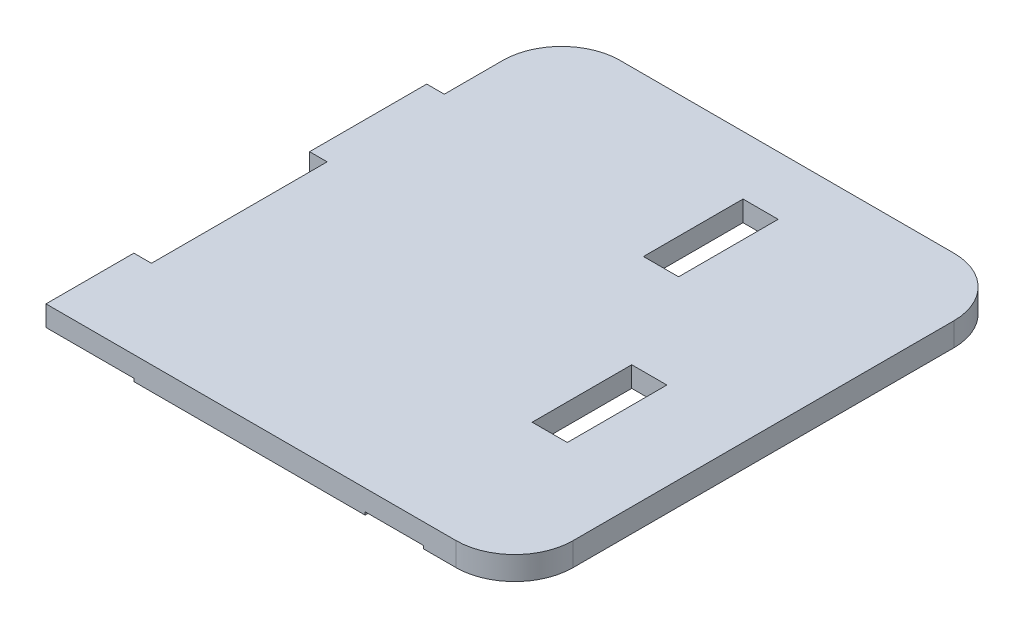
ISO-10303-21;
HEADER;
FILE_DESCRIPTION(('STEP AP214'),'2;1');
FILE_NAME('part.step','',(''),(''),'','','');
FILE_SCHEMA(('AUTOMOTIVE_DESIGN { 1 0 10303 214 1 1 1 1 }'));
ENDSEC;
DATA;
#1=APPLICATION_CONTEXT('core data for automotive mechanical design processes');
#2=APPLICATION_PROTOCOL_DEFINITION('international standard','automotive_design',2000,#1);
#3=PRODUCT_CONTEXT('',#1,'mechanical');
#4=PRODUCT('Part','Part','',(#3));
#5=PRODUCT_RELATED_PRODUCT_CATEGORY('part','',(#4));
#6=PRODUCT_DEFINITION_FORMATION('','',#4);
#7=PRODUCT_DEFINITION_CONTEXT('part definition',#1,'design');
#8=PRODUCT_DEFINITION('design','',#6,#7);
#9=PRODUCT_DEFINITION_SHAPE('','',#8);
#10=(LENGTH_UNIT() NAMED_UNIT(*) SI_UNIT(.MILLI.,.METRE.));
#11=(NAMED_UNIT(*) PLANE_ANGLE_UNIT() SI_UNIT($,.RADIAN.));
#12=(NAMED_UNIT(*) SI_UNIT($,.STERADIAN.) SOLID_ANGLE_UNIT());
#13=UNCERTAINTY_MEASURE_WITH_UNIT(LENGTH_MEASURE(1.E-05),#10,'distance_accuracy_value','');
#14=(GEOMETRIC_REPRESENTATION_CONTEXT(3) GLOBAL_UNCERTAINTY_ASSIGNED_CONTEXT((#13)) GLOBAL_UNIT_ASSIGNED_CONTEXT((#10,
#11,#12)) REPRESENTATION_CONTEXT('',''));
#15=CARTESIAN_POINT('',(0.,0.,0.));
#16=DIRECTION('',(0.,0.,1.));
#17=DIRECTION('',(1.,0.,0.));
#18=AXIS2_PLACEMENT_3D('',#15,#16,#17);
#19=CARTESIAN_POINT('',(0.,0.,0.));
#20=DIRECTION('',(0.,1.,0.));
#21=DIRECTION('',(0.,0.,1.));
#22=AXIS2_PLACEMENT_3D('',#19,#20,#21);
#23=PLANE('',#22);
#24=DIRECTION('',(1.,0.,0.));
#25=VECTOR('',#24,1.);
#26=CARTESIAN_POINT('',(0.,0.,0.));
#27=LINE('',#26,#25);
#28=CARTESIAN_POINT('',(6.448166537674,0.,0.));
#29=VERTEX_POINT('',#28);
#30=CARTESIAN_POINT('',(7.,0.,0.));
#31=VERTEX_POINT('',#30);
#32=EDGE_CURVE('E446',#29,#31,#27,.T.);
#33=ORIENTED_EDGE('',*,*,#32,.F.);
#34=DIRECTION('',(0.,0.,1.));
#35=VECTOR('',#34,1.);
#36=CARTESIAN_POINT('',(6.448166537674,0.,-2.4));
#37=LINE('',#36,#35);
#38=CARTESIAN_POINT('',(6.448166537674,0.,-2.4));
#39=VERTEX_POINT('',#38);
#40=EDGE_CURVE('E282',#39,#29,#37,.T.);
#41=ORIENTED_EDGE('',*,*,#40,.F.);
#42=DIRECTION('',(1.,0.,0.));
#43=VECTOR('',#42,1.);
#44=CARTESIAN_POINT('',(5.9,0.,-2.4));
#45=LINE('',#44,#43);
#46=CARTESIAN_POINT('',(6.5,0.,-2.4));
#47=VERTEX_POINT('',#46);
#48=EDGE_CURVE('E390',#39,#47,#45,.T.);
#49=ORIENTED_EDGE('',*,*,#48,.T.);
#50=DIRECTION('',(0.,0.,-1.));
#51=VECTOR('',#50,1.);
#52=CARTESIAN_POINT('',(6.5,0.,-2.4));
#53=LINE('',#52,#51);
#54=CARTESIAN_POINT('',(6.5,0.,-4.1));
#55=VERTEX_POINT('',#54);
#56=EDGE_CURVE('E403',#47,#55,#53,.T.);
#57=ORIENTED_EDGE('',*,*,#56,.T.);
#58=DIRECTION('',(-1.,0.,0.));
#59=VECTOR('',#58,1.);
#60=CARTESIAN_POINT('',(5.9,0.,-4.1));
#61=LINE('',#60,#59);
#62=CARTESIAN_POINT('',(6.448166537674,0.,-4.1));
#63=VERTEX_POINT('',#62);
#64=EDGE_CURVE('E394',#55,#63,#61,.T.);
#65=ORIENTED_EDGE('',*,*,#64,.T.);
#66=CARTESIAN_POINT('',(6.448166537674,0.,-5.1));
#67=VERTEX_POINT('',#66);
#68=EDGE_CURVE('E276',#67,#63,#37,.T.);
#69=ORIENTED_EDGE('',*,*,#68,.F.);
#70=CARTESIAN_POINT('',(5.9,0.,-5.1));
#71=DIRECTION('',(0.,-1.,0.));
#72=DIRECTION('',(0.,0.,-1.));
#73=AXIS2_PLACEMENT_3D('',#70,#71,#72);
#74=CIRCLE('',#73,0.548166537674001);
#75=CARTESIAN_POINT('',(5.97920351117561,0.,-5.64241437743017));
#76=VERTEX_POINT('',#75);
#77=EDGE_CURVE('E326',#76,#67,#74,.T.);
#78=ORIENTED_EDGE('',*,*,#77,.F.);
#79=DIRECTION('',(0.989506546188972,0.,0.144488044658277));
#80=VECTOR('',#79,1.);
#81=CARTESIAN_POINT('',(5.97920351117561,0.,-5.64241437743017));
#82=LINE('',#81,#80);
#83=CARTESIAN_POINT('',(4.9,0.,-5.8));
#84=VERTEX_POINT('',#83);
#85=EDGE_CURVE('E323',#84,#76,#82,.T.);
#86=ORIENTED_EDGE('',*,*,#85,.F.);
#87=DIRECTION('',(1.,0.,0.));
#88=VECTOR('',#87,1.);
#89=CARTESIAN_POINT('',(4.4,0.,-5.8));
#90=LINE('',#89,#88);
#91=CARTESIAN_POINT('',(5.,0.,-5.8));
#92=VERTEX_POINT('',#91);
#93=EDGE_CURVE('E418',#84,#92,#90,.T.);
#94=ORIENTED_EDGE('',*,*,#93,.T.);
#95=DIRECTION('',(0.,0.,-1.));
#96=VECTOR('',#95,1.);
#97=CARTESIAN_POINT('',(5.,0.,-7.5));
#98=LINE('',#97,#96);
#99=CARTESIAN_POINT('',(5.,0.,-7.5));
#100=VERTEX_POINT('',#99);
#101=EDGE_CURVE('E431',#92,#100,#98,.T.);
#102=ORIENTED_EDGE('',*,*,#101,.T.);
#103=DIRECTION('',(-1.,0.,0.));
#104=VECTOR('',#103,1.);
#105=CARTESIAN_POINT('',(4.4,0.,-7.5));
#106=LINE('',#105,#104);
#107=CARTESIAN_POINT('',(4.9,0.,-7.5));
#108=VERTEX_POINT('',#107);
#109=EDGE_CURVE('E422',#100,#108,#106,.T.);
#110=ORIENTED_EDGE('',*,*,#109,.T.);
#111=DIRECTION('',(0.,0.,1.));
#112=VECTOR('',#111,1.);
#113=CARTESIAN_POINT('',(4.9,0.,-5.8));
#114=LINE('',#113,#112);
#115=CARTESIAN_POINT('',(4.9,0.,-8.5));
#116=VERTEX_POINT('',#115);
#117=EDGE_CURVE('E321',#116,#108,#114,.T.);
#118=ORIENTED_EDGE('',*,*,#117,.F.);
#119=DIRECTION('',(-1.,0.,0.));
#120=VECTOR('',#119,1.);
#121=CARTESIAN_POINT('',(8.,0.,-8.5));
#122=LINE('',#121,#120);
#123=CARTESIAN_POINT('',(7.,0.,-8.5));
#124=VERTEX_POINT('',#123);
#125=EDGE_CURVE('E451',#124,#116,#122,.T.);
#126=ORIENTED_EDGE('',*,*,#125,.F.);
#127=CARTESIAN_POINT('',(7.,0.,-7.5));
#128=DIRECTION('',(0.,1.,0.));
#129=DIRECTION('',(0.,0.,1.));
#130=AXIS2_PLACEMENT_3D('',#127,#128,#129);
#131=CIRCLE('',#130,1.);
#132=CARTESIAN_POINT('',(8.,0.,-7.5));
#133=VERTEX_POINT('',#132);
#134=EDGE_CURVE('E506',#124,#133,#131,.F.);
#135=ORIENTED_EDGE('',*,*,#134,.T.);
#136=DIRECTION('',(0.,0.,-1.));
#137=VECTOR('',#136,1.);
#138=CARTESIAN_POINT('',(8.,0.,0.));
#139=LINE('',#138,#137);
#140=CARTESIAN_POINT('',(8.,0.,-1.));
#141=VERTEX_POINT('',#140);
#142=EDGE_CURVE('E475',#141,#133,#139,.T.);
#143=ORIENTED_EDGE('',*,*,#142,.F.);
#144=CARTESIAN_POINT('',(7.,0.,-1.));
#145=DIRECTION('',(0.,1.,0.));
#146=DIRECTION('',(0.,0.,1.));
#147=AXIS2_PLACEMENT_3D('',#144,#145,#146);
#148=CIRCLE('',#147,1.);
#149=EDGE_CURVE('E508',#141,#31,#148,.F.);
#150=ORIENTED_EDGE('',*,*,#149,.T.);
#151=EDGE_LOOP('',(#33,#41,#49,#57,#65,#69,#78,#86,#94,#102,#110,#118,#126,#135,#143,#150));
#152=FACE_BOUND('',#151,.T.);
#153=ADVANCED_FACE('F35',(#152),#23,.F.);
#154=CARTESIAN_POINT('',(0.,0.4,-1.5));
#155=DIRECTION('',(1.,0.,0.));
#156=DIRECTION('',(0.,0.,-1.));
#157=AXIS2_PLACEMENT_3D('',#154,#155,#156);
#158=PLANE('',#157);
#159=DIRECTION('',(0.,0.,-1.));
#160=VECTOR('',#159,1.);
#161=CARTESIAN_POINT('',(0.,0.05,-8.5));
#162=LINE('',#161,#160);
#163=CARTESIAN_POINT('',(0.,0.05,0.));
#164=VERTEX_POINT('',#163);
#165=CARTESIAN_POINT('',(0.,0.05,-1.5));
#166=VERTEX_POINT('',#165);
#167=EDGE_CURVE('E355',#164,#166,#162,.T.);
#168=ORIENTED_EDGE('',*,*,#167,.F.);
#169=DIRECTION('',(0.,-1.,0.));
#170=VECTOR('',#169,1.);
#171=CARTESIAN_POINT('',(0.,0.4,0.));
#172=LINE('',#171,#170);
#173=CARTESIAN_POINT('',(0.,0.4,0.));
#174=VERTEX_POINT('',#173);
#175=EDGE_CURVE('E498',#174,#164,#172,.T.);
#176=ORIENTED_EDGE('',*,*,#175,.F.);
#177=DIRECTION('',(0.,0.,1.));
#178=VECTOR('',#177,1.);
#179=CARTESIAN_POINT('',(0.,0.4,-1.5));
#180=LINE('',#179,#178);
#181=CARTESIAN_POINT('',(0.,0.4,-1.5));
#182=VERTEX_POINT('',#181);
#183=EDGE_CURVE('E447',#182,#174,#180,.T.);
#184=ORIENTED_EDGE('',*,*,#183,.F.);
#185=DIRECTION('',(0.,-1.,0.));
#186=VECTOR('',#185,1.);
#187=CARTESIAN_POINT('',(0.,0.4,-1.5));
#188=LINE('',#187,#186);
#189=EDGE_CURVE('E472',#182,#166,#188,.T.);
#190=ORIENTED_EDGE('',*,*,#189,.T.);
#191=EDGE_LOOP('',(#168,#176,#184,#190));
#192=FACE_BOUND('',#191,.T.);
#193=ADVANCED_FACE('F617',(#192),#158,.F.);
#194=CARTESIAN_POINT('',(0.299999999999999,0.4,-8.5));
#195=DIRECTION('',(1.,0.,0.));
#196=DIRECTION('',(0.,0.,-1.));
#197=AXIS2_PLACEMENT_3D('',#194,#195,#196);
#198=PLANE('',#197);
#199=DIRECTION('',(0.,0.,-1.));
#200=VECTOR('',#199,1.);
#201=CARTESIAN_POINT('',(0.299999999999999,0.05,-8.5));
#202=LINE('',#201,#200);
#203=CARTESIAN_POINT('',(0.299999999999999,0.05,-6.5));
#204=VERTEX_POINT('',#203);
#205=CARTESIAN_POINT('',(0.299999999999999,0.05,-7.5));
#206=VERTEX_POINT('',#205);
#207=EDGE_CURVE('E58',#204,#206,#202,.T.);
#208=ORIENTED_EDGE('',*,*,#207,.F.);
#209=DIRECTION('',(0.,-1.,0.));
#210=VECTOR('',#209,1.);
#211=CARTESIAN_POINT('',(0.299999999999999,0.4,-6.5));
#212=LINE('',#211,#210);
#213=CARTESIAN_POINT('',(0.299999999999999,0.4,-6.5));
#214=VERTEX_POINT('',#213);
#215=EDGE_CURVE('E495',#214,#204,#212,.T.);
#216=ORIENTED_EDGE('',*,*,#215,.F.);
#217=DIRECTION('',(0.,0.,1.));
#218=VECTOR('',#217,1.);
#219=CARTESIAN_POINT('',(0.299999999999999,0.4,-8.5));
#220=LINE('',#219,#218);
#221=CARTESIAN_POINT('',(0.299999999999999,0.4,-7.5));
#222=VERTEX_POINT('',#221);
#223=EDGE_CURVE('E460',#222,#214,#220,.T.);
#224=ORIENTED_EDGE('',*,*,#223,.F.);
#225=DIRECTION('',(0.,-1.,0.));
#226=VECTOR('',#225,1.);
#227=CARTESIAN_POINT('',(0.299999999999999,0.4,-7.5));
#228=LINE('',#227,#226);
#229=EDGE_CURVE('E524',#222,#206,#228,.T.);
#230=ORIENTED_EDGE('',*,*,#229,.T.);
#231=EDGE_LOOP('',(#208,#216,#224,#230));
#232=FACE_BOUND('',#231,.T.);
#233=ADVANCED_FACE('F588',(#232),#198,.F.);
#234=CARTESIAN_POINT('',(0.299999999999999,0.4,-6.5));
#235=DIRECTION('',(0.,0.,1.));
#236=DIRECTION('',(1.,0.,0.));
#237=AXIS2_PLACEMENT_3D('',#234,#235,#236);
#238=PLANE('',#237);
#239=DIRECTION('',(1.,0.,0.));
#240=VECTOR('',#239,1.);
#241=CARTESIAN_POINT('',(0.299999999999999,0.05,-6.5));
#242=LINE('',#241,#240);
#243=CARTESIAN_POINT('',(0.,0.05,-6.5));
#244=VERTEX_POINT('',#243);
#245=EDGE_CURVE('E365',#244,#204,#242,.T.);
#246=ORIENTED_EDGE('',*,*,#245,.F.);
#247=DIRECTION('',(0.,-1.,0.));
#248=VECTOR('',#247,1.);
#249=CARTESIAN_POINT('',(0.,0.4,-6.5));
#250=LINE('',#249,#248);
#251=CARTESIAN_POINT('',(0.,0.4,-6.5));
#252=VERTEX_POINT('',#251);
#253=EDGE_CURVE('E492',#252,#244,#250,.T.);
#254=ORIENTED_EDGE('',*,*,#253,.F.);
#255=DIRECTION('',(-1.,0.,0.));
#256=VECTOR('',#255,1.);
#257=CARTESIAN_POINT('',(0.299999999999999,0.4,-6.5));
#258=LINE('',#257,#256);
#259=EDGE_CURVE('E462',#214,#252,#258,.T.);
#260=ORIENTED_EDGE('',*,*,#259,.F.);
#261=ORIENTED_EDGE('',*,*,#215,.T.);
#262=EDGE_LOOP('',(#246,#254,#260,#261));
#263=FACE_BOUND('',#262,.T.);
#264=ADVANCED_FACE('F596',(#263),#238,.F.);
#265=CARTESIAN_POINT('',(0.,0.4,-6.5));
#266=DIRECTION('',(1.,0.,0.));
#267=DIRECTION('',(0.,0.,-1.));
#268=AXIS2_PLACEMENT_3D('',#265,#266,#267);
#269=PLANE('',#268);
#270=CARTESIAN_POINT('',(0.,0.05,-4.5));
#271=VERTEX_POINT('',#270);
#272=EDGE_CURVE('E354',#271,#244,#162,.T.);
#273=ORIENTED_EDGE('',*,*,#272,.F.);
#274=DIRECTION('',(0.,-1.,0.));
#275=VECTOR('',#274,1.);
#276=CARTESIAN_POINT('',(0.,0.4,-4.5));
#277=LINE('',#276,#275);
#278=CARTESIAN_POINT('',(0.,0.4,-4.5));
#279=VERTEX_POINT('',#278);
#280=EDGE_CURVE('E489',#279,#271,#277,.T.);
#281=ORIENTED_EDGE('',*,*,#280,.F.);
#282=DIRECTION('',(0.,0.,1.));
#283=VECTOR('',#282,1.);
#284=CARTESIAN_POINT('',(0.,0.4,-6.5));
#285=LINE('',#284,#283);
#286=EDGE_CURVE('E464',#252,#279,#285,.T.);
#287=ORIENTED_EDGE('',*,*,#286,.F.);
#288=ORIENTED_EDGE('',*,*,#253,.T.);
#289=EDGE_LOOP('',(#273,#281,#287,#288));
#290=FACE_BOUND('',#289,.T.);
#291=ADVANCED_FACE('F599',(#290),#269,.F.);
#292=CARTESIAN_POINT('',(0.,0.4,-4.5));
#293=DIRECTION('',(0.,0.,-1.));
#294=DIRECTION('',(-1.,0.,0.));
#295=AXIS2_PLACEMENT_3D('',#292,#293,#294);
#296=PLANE('',#295);
#297=DIRECTION('',(-1.,0.,0.));
#298=VECTOR('',#297,1.);
#299=CARTESIAN_POINT('',(0.,0.05,-4.5));
#300=LINE('',#299,#298);
#301=CARTESIAN_POINT('',(0.3,0.05,-4.5));
#302=VERTEX_POINT('',#301);
#303=EDGE_CURVE('E371',#302,#271,#300,.T.);
#304=ORIENTED_EDGE('',*,*,#303,.F.);
#305=DIRECTION('',(0.,-1.,0.));
#306=VECTOR('',#305,1.);
#307=CARTESIAN_POINT('',(0.3,0.4,-4.5));
#308=LINE('',#307,#306);
#309=CARTESIAN_POINT('',(0.3,0.4,-4.5));
#310=VERTEX_POINT('',#309);
#311=EDGE_CURVE('E486',#310,#302,#308,.T.);
#312=ORIENTED_EDGE('',*,*,#311,.F.);
#313=DIRECTION('',(1.,0.,0.));
#314=VECTOR('',#313,1.);
#315=CARTESIAN_POINT('',(0.,0.4,-4.5));
#316=LINE('',#315,#314);
#317=EDGE_CURVE('E466',#279,#310,#316,.T.);
#318=ORIENTED_EDGE('',*,*,#317,.F.);
#319=ORIENTED_EDGE('',*,*,#280,.T.);
#320=EDGE_LOOP('',(#304,#312,#318,#319));
#321=FACE_BOUND('',#320,.T.);
#322=ADVANCED_FACE('F604',(#321),#296,.F.);
#323=CARTESIAN_POINT('',(0.3,0.4,-4.5));
#324=DIRECTION('',(1.,0.,0.));
#325=DIRECTION('',(0.,0.,-1.));
#326=AXIS2_PLACEMENT_3D('',#323,#324,#325);
#327=PLANE('',#326);
#328=DIRECTION('',(0.,0.,-1.));
#329=VECTOR('',#328,1.);
#330=CARTESIAN_POINT('',(0.3,0.05,-4.5));
#331=LINE('',#330,#329);
#332=CARTESIAN_POINT('',(0.3,0.05,-1.5));
#333=VERTEX_POINT('',#332);
#334=EDGE_CURVE('E369',#333,#302,#331,.T.);
#335=ORIENTED_EDGE('',*,*,#334,.F.);
#336=DIRECTION('',(0.,-1.,0.));
#337=VECTOR('',#336,1.);
#338=CARTESIAN_POINT('',(0.3,0.4,-1.5));
#339=LINE('',#338,#337);
#340=CARTESIAN_POINT('',(0.3,0.4,-1.5));
#341=VERTEX_POINT('',#340);
#342=EDGE_CURVE('E483',#341,#333,#339,.T.);
#343=ORIENTED_EDGE('',*,*,#342,.F.);
#344=DIRECTION('',(0.,0.,1.));
#345=VECTOR('',#344,1.);
#346=CARTESIAN_POINT('',(0.3,0.4,-4.5));
#347=LINE('',#346,#345);
#348=EDGE_CURVE('E468',#310,#341,#347,.T.);
#349=ORIENTED_EDGE('',*,*,#348,.F.);
#350=ORIENTED_EDGE('',*,*,#311,.T.);
#351=EDGE_LOOP('',(#335,#343,#349,#350));
#352=FACE_BOUND('',#351,.T.);
#353=ADVANCED_FACE('F611',(#352),#327,.F.);
#354=CARTESIAN_POINT('',(0.3,0.4,-1.5));
#355=DIRECTION('',(0.,0.,1.));
#356=DIRECTION('',(1.,0.,0.));
#357=AXIS2_PLACEMENT_3D('',#354,#355,#356);
#358=PLANE('',#357);
#359=DIRECTION('',(1.,0.,0.));
#360=VECTOR('',#359,1.);
#361=CARTESIAN_POINT('',(0.3,0.05,-1.5));
#362=LINE('',#361,#360);
#363=EDGE_CURVE('E367',#166,#333,#362,.T.);
#364=ORIENTED_EDGE('',*,*,#363,.F.);
#365=ORIENTED_EDGE('',*,*,#189,.F.);
#366=DIRECTION('',(-1.,0.,0.));
#367=VECTOR('',#366,1.);
#368=CARTESIAN_POINT('',(0.3,0.4,-1.5));
#369=LINE('',#368,#367);
#370=EDGE_CURVE('E470',#341,#182,#369,.T.);
#371=ORIENTED_EDGE('',*,*,#370,.F.);
#372=ORIENTED_EDGE('',*,*,#342,.T.);
#373=EDGE_LOOP('',(#364,#365,#371,#372));
#374=FACE_BOUND('',#373,.T.);
#375=ADVANCED_FACE('F614',(#374),#358,.F.);
#376=CARTESIAN_POINT('',(4.4,0.4,-7.5));
#377=DIRECTION('',(1.,0.,0.));
#378=DIRECTION('',(0.,0.,-1.));
#379=AXIS2_PLACEMENT_3D('',#376,#377,#378);
#380=PLANE('',#379);
#381=DIRECTION('',(0.,-1.,0.));
#382=VECTOR('',#381,1.);
#383=CARTESIAN_POINT('',(4.4,0.4,-5.8));
#384=LINE('',#383,#382);
#385=CARTESIAN_POINT('',(4.4,0.4,-5.8));
#386=VERTEX_POINT('',#385);
#387=CARTESIAN_POINT('',(4.4,0.05,-5.8));
#388=VERTEX_POINT('',#387);
#389=EDGE_CURVE('E443',#386,#388,#384,.T.);
#390=ORIENTED_EDGE('',*,*,#389,.T.);
#391=DIRECTION('',(0.,0.,-1.));
#392=VECTOR('',#391,1.);
#393=CARTESIAN_POINT('',(4.4,0.05,-7.5));
#394=LINE('',#393,#392);
#395=CARTESIAN_POINT('',(4.4,0.05,-7.5));
#396=VERTEX_POINT('',#395);
#397=EDGE_CURVE('E380',#388,#396,#394,.T.);
#398=ORIENTED_EDGE('',*,*,#397,.T.);
#399=DIRECTION('',(0.,-1.,0.));
#400=VECTOR('',#399,1.);
#401=CARTESIAN_POINT('',(4.4,0.4,-7.5));
#402=LINE('',#401,#400);
#403=CARTESIAN_POINT('',(4.4,0.4,-7.5));
#404=VERTEX_POINT('',#403);
#405=EDGE_CURVE('E429',#404,#396,#402,.T.);
#406=ORIENTED_EDGE('',*,*,#405,.F.);
#407=DIRECTION('',(0.,0.,1.));
#408=VECTOR('',#407,1.);
#409=CARTESIAN_POINT('',(4.4,0.4,-7.5));
#410=LINE('',#409,#408);
#411=EDGE_CURVE('E419',#404,#386,#410,.T.);
#412=ORIENTED_EDGE('',*,*,#411,.T.);
#413=EDGE_LOOP('',(#390,#398,#406,#412));
#414=FACE_BOUND('',#413,.T.);
#415=ADVANCED_FACE('F666',(#414),#380,.T.);
#416=CARTESIAN_POINT('',(5.9,0.4,-2.4));
#417=DIRECTION('',(1.,0.,0.));
#418=DIRECTION('',(0.,0.,-1.));
#419=AXIS2_PLACEMENT_3D('',#416,#417,#418);
#420=PLANE('',#419);
#421=DIRECTION('',(0.,-1.,0.));
#422=VECTOR('',#421,1.);
#423=CARTESIAN_POINT('',(5.9,0.4,-2.4));
#424=LINE('',#423,#422);
#425=CARTESIAN_POINT('',(5.9,0.4,-2.4));
#426=VERTEX_POINT('',#425);
#427=CARTESIAN_POINT('',(5.9,0.05,-2.4));
#428=VERTEX_POINT('',#427);
#429=EDGE_CURVE('E415',#426,#428,#424,.T.);
#430=ORIENTED_EDGE('',*,*,#429,.T.);
#431=DIRECTION('',(0.,0.,-1.));
#432=VECTOR('',#431,1.);
#433=CARTESIAN_POINT('',(5.9,0.05,-2.4));
#434=LINE('',#433,#432);
#435=CARTESIAN_POINT('',(5.9,0.05,-4.1));
#436=VERTEX_POINT('',#435);
#437=EDGE_CURVE('E373',#428,#436,#434,.T.);
#438=ORIENTED_EDGE('',*,*,#437,.T.);
#439=DIRECTION('',(0.,-1.,0.));
#440=VECTOR('',#439,1.);
#441=CARTESIAN_POINT('',(5.9,0.4,-4.1));
#442=LINE('',#441,#440);
#443=CARTESIAN_POINT('',(5.9,0.4,-4.1));
#444=VERTEX_POINT('',#443);
#445=EDGE_CURVE('E401',#444,#436,#442,.T.);
#446=ORIENTED_EDGE('',*,*,#445,.F.);
#447=DIRECTION('',(0.,0.,1.));
#448=VECTOR('',#447,1.);
#449=CARTESIAN_POINT('',(5.9,0.4,-2.4));
#450=LINE('',#449,#448);
#451=EDGE_CURVE('E391',#444,#426,#450,.T.);
#452=ORIENTED_EDGE('',*,*,#451,.T.);
#453=EDGE_LOOP('',(#430,#438,#446,#452));
#454=FACE_BOUND('',#453,.T.);
#455=ADVANCED_FACE('F541',(#454),#420,.T.);
#456=CARTESIAN_POINT('',(1.3,0.4,-7.5));
#457=DIRECTION('',(0.,-1.,0.));
#458=DIRECTION('',(0.,0.,-1.));
#459=AXIS2_PLACEMENT_3D('',#456,#457,#458);
#460=CYLINDRICAL_SURFACE('',#459,1.);
#461=DIRECTION('',(0.,-1.,0.));
#462=VECTOR('',#461,1.);
#463=CARTESIAN_POINT('',(1.3,0.4,-8.5));
#464=LINE('',#463,#462);
#465=CARTESIAN_POINT('',(1.3,0.05,-8.5));
#466=VERTEX_POINT('',#465);
#467=CARTESIAN_POINT('',(1.3,0.4,-8.5));
#468=VERTEX_POINT('',#467);
#469=EDGE_CURVE('E519',#466,#468,#464,.F.);
#470=ORIENTED_EDGE('',*,*,#469,.F.);
#471=CARTESIAN_POINT('',(1.3,0.05,-7.5));
#472=DIRECTION('',(0.,-1.,0.));
#473=DIRECTION('',(0.,0.,-1.));
#474=AXIS2_PLACEMENT_3D('',#471,#472,#473);
#475=CIRCLE('',#474,1.);
#476=EDGE_CURVE('E527',#466,#206,#475,.F.);
#477=ORIENTED_EDGE('',*,*,#476,.T.);
#478=ORIENTED_EDGE('',*,*,#229,.F.);
#479=CARTESIAN_POINT('',(1.3,0.4,-7.5));
#480=DIRECTION('',(0.,1.,0.));
#481=DIRECTION('',(0.,0.,1.));
#482=AXIS2_PLACEMENT_3D('',#479,#480,#481);
#483=CIRCLE('',#482,1.);
#484=EDGE_CURVE('E513',#468,#222,#483,.T.);
#485=ORIENTED_EDGE('',*,*,#484,.F.);
#486=EDGE_LOOP('',(#470,#477,#478,#485));
#487=FACE_BOUND('',#486,.T.);
#488=ADVANCED_FACE('F37',(#487),#460,.T.);
#489=CARTESIAN_POINT('',(0.,0.4,0.));
#490=DIRECTION('',(0.,1.,0.));
#491=DIRECTION('',(0.,0.,1.));
#492=AXIS2_PLACEMENT_3D('',#489,#490,#491);
#493=PLANE('',#492);
#494=DIRECTION('',(1.,0.,0.));
#495=VECTOR('',#494,1.);
#496=CARTESIAN_POINT('',(0.,0.4,0.));
#497=LINE('',#496,#495);
#498=CARTESIAN_POINT('',(7.,0.4,0.));
#499=VERTEX_POINT('',#498);
#500=EDGE_CURVE('E450',#174,#499,#497,.T.);
#501=ORIENTED_EDGE('',*,*,#500,.T.);
#502=CARTESIAN_POINT('',(7.,0.4,-1.));
#503=DIRECTION('',(0.,1.,0.));
#504=DIRECTION('',(0.,0.,1.));
#505=AXIS2_PLACEMENT_3D('',#502,#503,#504);
#506=CIRCLE('',#505,1.);
#507=CARTESIAN_POINT('',(8.,0.4,-1.));
#508=VERTEX_POINT('',#507);
#509=EDGE_CURVE('E517',#499,#508,#506,.T.);
#510=ORIENTED_EDGE('',*,*,#509,.T.);
#511=DIRECTION('',(0.,0.,-1.));
#512=VECTOR('',#511,1.);
#513=CARTESIAN_POINT('',(8.,0.4,0.));
#514=LINE('',#513,#512);
#515=CARTESIAN_POINT('',(8.,0.4,-7.5));
#516=VERTEX_POINT('',#515);
#517=EDGE_CURVE('E454',#508,#516,#514,.T.);
#518=ORIENTED_EDGE('',*,*,#517,.T.);
#519=CARTESIAN_POINT('',(7.,0.4,-7.5));
#520=DIRECTION('',(0.,1.,0.));
#521=DIRECTION('',(0.,0.,1.));
#522=AXIS2_PLACEMENT_3D('',#519,#520,#521);
#523=CIRCLE('',#522,1.);
#524=CARTESIAN_POINT('',(7.,0.4,-8.5));
#525=VERTEX_POINT('',#524);
#526=EDGE_CURVE('E515',#516,#525,#523,.T.);
#527=ORIENTED_EDGE('',*,*,#526,.T.);
#528=DIRECTION('',(-1.,0.,0.));
#529=VECTOR('',#528,1.);
#530=CARTESIAN_POINT('',(8.,0.4,-8.5));
#531=LINE('',#530,#529);
#532=EDGE_CURVE('E457',#525,#468,#531,.T.);
#533=ORIENTED_EDGE('',*,*,#532,.T.);
#534=ORIENTED_EDGE('',*,*,#484,.T.);
#535=ORIENTED_EDGE('',*,*,#223,.T.);
#536=ORIENTED_EDGE('',*,*,#259,.T.);
#537=ORIENTED_EDGE('',*,*,#286,.T.);
#538=ORIENTED_EDGE('',*,*,#317,.T.);
#539=ORIENTED_EDGE('',*,*,#348,.T.);
#540=ORIENTED_EDGE('',*,*,#370,.T.);
#541=ORIENTED_EDGE('',*,*,#183,.T.);
#542=EDGE_LOOP('',(#501,#510,#518,#527,#533,#534,#535,#536,#537,#538,#539,#540,#541));
#543=FACE_BOUND('',#542,.T.);
#544=DIRECTION('',(1.,0.,0.));
#545=VECTOR('',#544,1.);
#546=CARTESIAN_POINT('',(4.4,0.4,-5.8));
#547=LINE('',#546,#545);
#548=CARTESIAN_POINT('',(5.,0.4,-5.8));
#549=VERTEX_POINT('',#548);
#550=EDGE_CURVE('E421',#386,#549,#547,.T.);
#551=ORIENTED_EDGE('',*,*,#550,.F.);
#552=ORIENTED_EDGE('',*,*,#411,.F.);
#553=DIRECTION('',(-1.,0.,0.));
#554=VECTOR('',#553,1.);
#555=CARTESIAN_POINT('',(4.4,0.4,-7.5));
#556=LINE('',#555,#554);
#557=CARTESIAN_POINT('',(5.,0.4,-7.5));
#558=VERTEX_POINT('',#557);
#559=EDGE_CURVE('E427',#558,#404,#556,.T.);
#560=ORIENTED_EDGE('',*,*,#559,.F.);
#561=DIRECTION('',(0.,0.,-1.));
#562=VECTOR('',#561,1.);
#563=CARTESIAN_POINT('',(5.,0.4,-7.5));
#564=LINE('',#563,#562);
#565=EDGE_CURVE('E424',#549,#558,#564,.T.);
#566=ORIENTED_EDGE('',*,*,#565,.F.);
#567=EDGE_LOOP('',(#551,#552,#560,#566));
#568=FACE_BOUND('',#567,.T.);
#569=DIRECTION('',(1.,0.,0.));
#570=VECTOR('',#569,1.);
#571=CARTESIAN_POINT('',(5.9,0.4,-2.4));
#572=LINE('',#571,#570);
#573=CARTESIAN_POINT('',(6.5,0.4,-2.4));
#574=VERTEX_POINT('',#573);
#575=EDGE_CURVE('E393',#426,#574,#572,.T.);
#576=ORIENTED_EDGE('',*,*,#575,.F.);
#577=ORIENTED_EDGE('',*,*,#451,.F.);
#578=DIRECTION('',(-1.,0.,0.));
#579=VECTOR('',#578,1.);
#580=CARTESIAN_POINT('',(5.9,0.4,-4.1));
#581=LINE('',#580,#579);
#582=CARTESIAN_POINT('',(6.5,0.4,-4.1));
#583=VERTEX_POINT('',#582);
#584=EDGE_CURVE('E399',#583,#444,#581,.T.);
#585=ORIENTED_EDGE('',*,*,#584,.F.);
#586=DIRECTION('',(0.,0.,-1.));
#587=VECTOR('',#586,1.);
#588=CARTESIAN_POINT('',(6.5,0.4,-2.4));
#589=LINE('',#588,#587);
#590=EDGE_CURVE('E396',#574,#583,#589,.T.);
#591=ORIENTED_EDGE('',*,*,#590,.F.);
#592=EDGE_LOOP('',(#576,#577,#585,#591));
#593=FACE_BOUND('',#592,.T.);
#594=ADVANCED_FACE('F550',(#543,#568,#593),#493,.T.);
#595=CARTESIAN_POINT('',(3.9,0.,-8.5));
#596=VERTEX_POINT('',#595);
#597=CARTESIAN_POINT('',(1.5,0.,-8.5));
#598=VERTEX_POINT('',#597);
#599=EDGE_CURVE('E478',#596,#598,#122,.T.);
#600=ORIENTED_EDGE('',*,*,#599,.F.);
#601=DIRECTION('',(0.,0.,-1.));
#602=VECTOR('',#601,1.);
#603=CARTESIAN_POINT('',(3.9,0.,-5.8));
#604=LINE('',#603,#602);
#605=CARTESIAN_POINT('',(3.9,0.,-5.36770778392691));
#606=VERTEX_POINT('',#605);
#607=EDGE_CURVE('E319',#606,#596,#604,.T.);
#608=ORIENTED_EDGE('',*,*,#607,.F.);
#609=CARTESIAN_POINT('',(4.4,0.,-5.36770778392691));
#610=DIRECTION('',(0.,-1.,0.));
#611=DIRECTION('',(0.,0.,-1.));
#612=AXIS2_PLACEMENT_3D('',#609,#610,#611);
#613=CIRCLE('',#612,0.500000000000001);
#614=CARTESIAN_POINT('',(4.32775597767086,0.,-4.87295451083242));
#615=VERTEX_POINT('',#614);
#616=EDGE_CURVE('E316',#615,#606,#613,.T.);
#617=ORIENTED_EDGE('',*,*,#616,.F.);
#618=DIRECTION('',(-0.989506546188972,0.,-0.144488044658277));
#619=VECTOR('',#618,1.);
#620=CARTESIAN_POINT('',(5.448166537674,0.,-4.70935182255023));
#621=LINE('',#620,#619);
#622=CARTESIAN_POINT('',(5.448166537674,0.,-4.70935182255023));
#623=VERTEX_POINT('',#622);
#624=EDGE_CURVE('E312',#623,#615,#621,.T.);
#625=ORIENTED_EDGE('',*,*,#624,.F.);
#626=DIRECTION('',(0.,0.,-1.));
#627=VECTOR('',#626,1.);
#628=CARTESIAN_POINT('',(5.448166537674,0.,-2.4));
#629=LINE('',#628,#627);
#630=CARTESIAN_POINT('',(5.448166537674,0.,0.));
#631=VERTEX_POINT('',#630);
#632=EDGE_CURVE('E309',#631,#623,#629,.T.);
#633=ORIENTED_EDGE('',*,*,#632,.F.);
#634=CARTESIAN_POINT('',(1.5,0.,0.));
#635=VERTEX_POINT('',#634);
#636=EDGE_CURVE('E474',#635,#631,#27,.T.);
#637=ORIENTED_EDGE('',*,*,#636,.F.);
#638=DIRECTION('',(0.,0.,1.));
#639=VECTOR('',#638,1.);
#640=CARTESIAN_POINT('',(1.5,0.,-8.5));
#641=LINE('',#640,#639);
#642=EDGE_CURVE('E352',#598,#635,#641,.T.);
#643=ORIENTED_EDGE('',*,*,#642,.F.);
#644=EDGE_LOOP('',(#600,#608,#617,#625,#633,#637,#643));
#645=FACE_BOUND('',#644,.T.);
#646=ADVANCED_FACE('F632',(#645),#23,.F.);
#647=CARTESIAN_POINT('',(0.,0.4,0.));
#648=DIRECTION('',(0.,0.,-1.));
#649=DIRECTION('',(-1.,0.,0.));
#650=AXIS2_PLACEMENT_3D('',#647,#648,#649);
#651=PLANE('',#650);
#652=DIRECTION('',(-1.,0.,0.));
#653=VECTOR('',#652,1.);
#654=CARTESIAN_POINT('',(6.448166537674,0.05,0.));
#655=LINE('',#654,#653);
#656=CARTESIAN_POINT('',(6.448166537674,0.05,0.));
#657=VERTEX_POINT('',#656);
#658=CARTESIAN_POINT('',(5.448166537674,0.05,0.));
#659=VERTEX_POINT('',#658);
#660=EDGE_CURVE('E270',#657,#659,#655,.T.);
#661=ORIENTED_EDGE('',*,*,#660,.F.);
#662=DIRECTION('',(0.,-1.,0.));
#663=VECTOR('',#662,1.);
#664=CARTESIAN_POINT('',(6.448166537674,0.05,0.));
#665=LINE('',#664,#663);
#666=EDGE_CURVE('E279',#657,#29,#665,.T.);
#667=ORIENTED_EDGE('',*,*,#666,.T.);
#668=ORIENTED_EDGE('',*,*,#32,.T.);
#669=DIRECTION('',(0.,-1.,0.));
#670=VECTOR('',#669,1.);
#671=CARTESIAN_POINT('',(7.,0.4,0.));
#672=LINE('',#671,#670);
#673=EDGE_CURVE('E511',#31,#499,#672,.F.);
#674=ORIENTED_EDGE('',*,*,#673,.T.);
#675=ORIENTED_EDGE('',*,*,#500,.F.);
#676=ORIENTED_EDGE('',*,*,#175,.T.);
#677=DIRECTION('',(-1.,0.,0.));
#678=VECTOR('',#677,1.);
#679=CARTESIAN_POINT('',(1.5,0.05,0.));
#680=LINE('',#679,#678);
#681=CARTESIAN_POINT('',(1.5,0.05,0.));
#682=VERTEX_POINT('',#681);
#683=EDGE_CURVE('E351',#682,#164,#680,.T.);
#684=ORIENTED_EDGE('',*,*,#683,.F.);
#685=DIRECTION('',(0.,-1.,0.));
#686=VECTOR('',#685,1.);
#687=CARTESIAN_POINT('',(1.5,0.05,0.));
#688=LINE('',#687,#686);
#689=EDGE_CURVE('E359',#682,#635,#688,.T.);
#690=ORIENTED_EDGE('',*,*,#689,.T.);
#691=ORIENTED_EDGE('',*,*,#636,.T.);
#692=DIRECTION('',(0.,-1.,0.));
#693=VECTOR('',#692,1.);
#694=CARTESIAN_POINT('',(5.448166537674,0.05,0.));
#695=LINE('',#694,#693);
#696=EDGE_CURVE('E285',#659,#631,#695,.T.);
#697=ORIENTED_EDGE('',*,*,#696,.F.);
#698=EDGE_LOOP('',(#661,#667,#668,#674,#675,#676,#684,#690,#691,#697));
#699=FACE_BOUND('',#698,.T.);
#700=ADVANCED_FACE('F288',(#699),#651,.F.);
#701=CARTESIAN_POINT('',(8.,0.4,0.));
#702=DIRECTION('',(-1.,0.,0.));
#703=DIRECTION('',(0.,0.,1.));
#704=AXIS2_PLACEMENT_3D('',#701,#702,#703);
#705=PLANE('',#704);
#706=ORIENTED_EDGE('',*,*,#517,.F.);
#707=DIRECTION('',(0.,-1.,0.));
#708=VECTOR('',#707,1.);
#709=CARTESIAN_POINT('',(8.,0.4,-1.));
#710=LINE('',#709,#708);
#711=EDGE_CURVE('E503',#508,#141,#710,.T.);
#712=ORIENTED_EDGE('',*,*,#711,.T.);
#713=ORIENTED_EDGE('',*,*,#142,.T.);
#714=DIRECTION('',(0.,-1.,0.));
#715=VECTOR('',#714,1.);
#716=CARTESIAN_POINT('',(8.,0.4,-7.5));
#717=LINE('',#716,#715);
#718=EDGE_CURVE('E501',#133,#516,#717,.F.);
#719=ORIENTED_EDGE('',*,*,#718,.T.);
#720=EDGE_LOOP('',(#706,#712,#713,#719));
#721=FACE_BOUND('',#720,.T.);
#722=ADVANCED_FACE('F569',(#721),#705,.F.);
#723=CARTESIAN_POINT('',(8.,0.4,-8.5));
#724=DIRECTION('',(0.,0.,1.));
#725=DIRECTION('',(1.,0.,0.));
#726=AXIS2_PLACEMENT_3D('',#723,#724,#725);
#727=PLANE('',#726);
#728=ORIENTED_EDGE('',*,*,#125,.T.);
#729=DIRECTION('',(0.,-1.,0.));
#730=VECTOR('',#729,1.);
#731=CARTESIAN_POINT('',(4.9,0.05,-8.5));
#732=LINE('',#731,#730);
#733=CARTESIAN_POINT('',(4.9,0.05,-8.5));
#734=VERTEX_POINT('',#733);
#735=EDGE_CURVE('E336',#734,#116,#732,.T.);
#736=ORIENTED_EDGE('',*,*,#735,.F.);
#737=DIRECTION('',(1.,0.,0.));
#738=VECTOR('',#737,1.);
#739=CARTESIAN_POINT('',(8.,0.05,-8.5));
#740=LINE('',#739,#738);
#741=CARTESIAN_POINT('',(3.9,0.05,-8.5));
#742=VERTEX_POINT('',#741);
#743=EDGE_CURVE('E386',#742,#734,#740,.T.);
#744=ORIENTED_EDGE('',*,*,#743,.F.);
#745=DIRECTION('',(0.,-1.,0.));
#746=VECTOR('',#745,1.);
#747=CARTESIAN_POINT('',(3.9,0.05,-8.5));
#748=LINE('',#747,#746);
#749=EDGE_CURVE('E338',#742,#596,#748,.T.);
#750=ORIENTED_EDGE('',*,*,#749,.T.);
#751=ORIENTED_EDGE('',*,*,#599,.T.);
#752=DIRECTION('',(0.,-1.,0.));
#753=VECTOR('',#752,1.);
#754=CARTESIAN_POINT('',(1.5,0.05,-8.5));
#755=LINE('',#754,#753);
#756=CARTESIAN_POINT('',(1.5,0.05,-8.5));
#757=VERTEX_POINT('',#756);
#758=EDGE_CURVE('E313',#757,#598,#755,.T.);
#759=ORIENTED_EDGE('',*,*,#758,.F.);
#760=DIRECTION('',(1.,0.,0.));
#761=VECTOR('',#760,1.);
#762=CARTESIAN_POINT('',(1.5,0.05,-8.5));
#763=LINE('',#762,#761);
#764=EDGE_CURVE('E357',#466,#757,#763,.T.);
#765=ORIENTED_EDGE('',*,*,#764,.F.);
#766=ORIENTED_EDGE('',*,*,#469,.T.);
#767=ORIENTED_EDGE('',*,*,#532,.F.);
#768=DIRECTION('',(0.,-1.,0.));
#769=VECTOR('',#768,1.);
#770=CARTESIAN_POINT('',(7.,0.4,-8.5));
#771=LINE('',#770,#769);
#772=EDGE_CURVE('E521',#525,#124,#771,.T.);
#773=ORIENTED_EDGE('',*,*,#772,.T.);
#774=EDGE_LOOP('',(#728,#736,#744,#750,#751,#759,#765,#766,#767,#773));
#775=FACE_BOUND('',#774,.T.);
#776=ADVANCED_FACE('F579',(#775),#727,.F.);
#777=CARTESIAN_POINT('',(4.4,0.4,-5.8));
#778=DIRECTION('',(0.,0.,-1.));
#779=DIRECTION('',(-1.,0.,0.));
#780=AXIS2_PLACEMENT_3D('',#777,#778,#779);
#781=PLANE('',#780);
#782=DIRECTION('',(0.,-1.,0.));
#783=VECTOR('',#782,1.);
#784=CARTESIAN_POINT('',(4.9,0.05,-5.8));
#785=LINE('',#784,#783);
#786=CARTESIAN_POINT('',(4.9,0.05,-5.8));
#787=VERTEX_POINT('',#786);
#788=EDGE_CURVE('E334',#787,#84,#785,.T.);
#789=ORIENTED_EDGE('',*,*,#788,.F.);
#790=DIRECTION('',(-1.,0.,0.));
#791=VECTOR('',#790,1.);
#792=CARTESIAN_POINT('',(4.4,0.05,-5.8));
#793=LINE('',#792,#791);
#794=EDGE_CURVE('E383',#787,#388,#793,.T.);
#795=ORIENTED_EDGE('',*,*,#794,.T.);
#796=ORIENTED_EDGE('',*,*,#389,.F.);
#797=ORIENTED_EDGE('',*,*,#550,.T.);
#798=DIRECTION('',(0.,-1.,0.));
#799=VECTOR('',#798,1.);
#800=CARTESIAN_POINT('',(5.,0.4,-5.8));
#801=LINE('',#800,#799);
#802=EDGE_CURVE('E440',#549,#92,#801,.T.);
#803=ORIENTED_EDGE('',*,*,#802,.T.);
#804=ORIENTED_EDGE('',*,*,#93,.F.);
#805=EDGE_LOOP('',(#789,#795,#796,#797,#803,#804));
#806=FACE_BOUND('',#805,.T.);
#807=ADVANCED_FACE('F671',(#806),#781,.T.);
#808=CARTESIAN_POINT('',(5.,0.4,-7.5));
#809=DIRECTION('',(-1.,0.,0.));
#810=DIRECTION('',(0.,0.,1.));
#811=AXIS2_PLACEMENT_3D('',#808,#809,#810);
#812=PLANE('',#811);
#813=ORIENTED_EDGE('',*,*,#101,.F.);
#814=ORIENTED_EDGE('',*,*,#802,.F.);
#815=ORIENTED_EDGE('',*,*,#565,.T.);
#816=DIRECTION('',(0.,-1.,0.));
#817=VECTOR('',#816,1.);
#818=CARTESIAN_POINT('',(5.,0.4,-7.5));
#819=LINE('',#818,#817);
#820=EDGE_CURVE('E438',#558,#100,#819,.T.);
#821=ORIENTED_EDGE('',*,*,#820,.T.);
#822=EDGE_LOOP('',(#813,#814,#815,#821));
#823=FACE_BOUND('',#822,.T.);
#824=ADVANCED_FACE('F660',(#823),#812,.T.);
#825=CARTESIAN_POINT('',(4.4,0.4,-7.5));
#826=DIRECTION('',(0.,0.,1.));
#827=DIRECTION('',(1.,0.,0.));
#828=AXIS2_PLACEMENT_3D('',#825,#826,#827);
#829=PLANE('',#828);
#830=DIRECTION('',(0.,1.,0.));
#831=VECTOR('',#830,1.);
#832=CARTESIAN_POINT('',(4.9,0.4,-7.5));
#833=LINE('',#832,#831);
#834=CARTESIAN_POINT('',(4.9,0.05,-7.5));
#835=VERTEX_POINT('',#834);
#836=EDGE_CURVE('E11',#108,#835,#833,.T.);
#837=ORIENTED_EDGE('',*,*,#836,.F.);
#838=ORIENTED_EDGE('',*,*,#109,.F.);
#839=ORIENTED_EDGE('',*,*,#820,.F.);
#840=ORIENTED_EDGE('',*,*,#559,.T.);
#841=ORIENTED_EDGE('',*,*,#405,.T.);
#842=DIRECTION('',(1.,0.,0.));
#843=VECTOR('',#842,1.);
#844=CARTESIAN_POINT('',(4.4,0.05,-7.5));
#845=LINE('',#844,#843);
#846=EDGE_CURVE('E377',#396,#835,#845,.T.);
#847=ORIENTED_EDGE('',*,*,#846,.T.);
#848=EDGE_LOOP('',(#837,#838,#839,#840,#841,#847));
#849=FACE_BOUND('',#848,.T.);
#850=ADVANCED_FACE('F654',(#849),#829,.T.);
#851=CARTESIAN_POINT('',(5.9,0.4,-2.4));
#852=DIRECTION('',(0.,0.,-1.));
#853=DIRECTION('',(-1.,0.,0.));
#854=AXIS2_PLACEMENT_3D('',#851,#852,#853);
#855=PLANE('',#854);
#856=DIRECTION('',(0.,-1.,0.));
#857=VECTOR('',#856,1.);
#858=CARTESIAN_POINT('',(6.448166537674,0.4,-2.4));
#859=LINE('',#858,#857);
#860=CARTESIAN_POINT('',(6.448166537674,0.05,-2.4));
#861=VERTEX_POINT('',#860);
#862=EDGE_CURVE('E388',#861,#39,#859,.T.);
#863=ORIENTED_EDGE('',*,*,#862,.F.);
#864=DIRECTION('',(-1.,0.,0.));
#865=VECTOR('',#864,1.);
#866=CARTESIAN_POINT('',(5.9,0.05,-2.4));
#867=LINE('',#866,#865);
#868=EDGE_CURVE('E273',#861,#428,#867,.T.);
#869=ORIENTED_EDGE('',*,*,#868,.T.);
#870=ORIENTED_EDGE('',*,*,#429,.F.);
#871=ORIENTED_EDGE('',*,*,#575,.T.);
#872=DIRECTION('',(0.,-1.,0.));
#873=VECTOR('',#872,1.);
#874=CARTESIAN_POINT('',(6.5,0.4,-2.4));
#875=LINE('',#874,#873);
#876=EDGE_CURVE('E412',#574,#47,#875,.T.);
#877=ORIENTED_EDGE('',*,*,#876,.T.);
#878=ORIENTED_EDGE('',*,*,#48,.F.);
#879=EDGE_LOOP('',(#863,#869,#870,#871,#877,#878));
#880=FACE_BOUND('',#879,.T.);
#881=ADVANCED_FACE('F546',(#880),#855,.T.);
#882=CARTESIAN_POINT('',(6.5,0.4,-2.4));
#883=DIRECTION('',(-1.,0.,0.));
#884=DIRECTION('',(0.,0.,1.));
#885=AXIS2_PLACEMENT_3D('',#882,#883,#884);
#886=PLANE('',#885);
#887=ORIENTED_EDGE('',*,*,#56,.F.);
#888=ORIENTED_EDGE('',*,*,#876,.F.);
#889=ORIENTED_EDGE('',*,*,#590,.T.);
#890=DIRECTION('',(0.,-1.,0.));
#891=VECTOR('',#890,1.);
#892=CARTESIAN_POINT('',(6.5,0.4,-4.1));
#893=LINE('',#892,#891);
#894=EDGE_CURVE('E410',#583,#55,#893,.T.);
#895=ORIENTED_EDGE('',*,*,#894,.T.);
#896=EDGE_LOOP('',(#887,#888,#889,#895));
#897=FACE_BOUND('',#896,.T.);
#898=ADVANCED_FACE('F554',(#897),#886,.T.);
#899=CARTESIAN_POINT('',(5.9,0.4,-4.1));
#900=DIRECTION('',(0.,0.,1.));
#901=DIRECTION('',(1.,0.,0.));
#902=AXIS2_PLACEMENT_3D('',#899,#900,#901);
#903=PLANE('',#902);
#904=DIRECTION('',(0.,1.,0.));
#905=VECTOR('',#904,1.);
#906=CARTESIAN_POINT('',(6.448166537674,0.4,-4.1));
#907=LINE('',#906,#905);
#908=CARTESIAN_POINT('',(6.448166537674,0.05,-4.1));
#909=VERTEX_POINT('',#908);
#910=EDGE_CURVE('E43',#63,#909,#907,.T.);
#911=ORIENTED_EDGE('',*,*,#910,.F.);
#912=ORIENTED_EDGE('',*,*,#64,.F.);
#913=ORIENTED_EDGE('',*,*,#894,.F.);
#914=ORIENTED_EDGE('',*,*,#584,.T.);
#915=ORIENTED_EDGE('',*,*,#445,.T.);
#916=DIRECTION('',(1.,0.,0.));
#917=VECTOR('',#916,1.);
#918=CARTESIAN_POINT('',(5.9,0.05,-4.1));
#919=LINE('',#918,#917);
#920=EDGE_CURVE('E529',#436,#909,#919,.T.);
#921=ORIENTED_EDGE('',*,*,#920,.T.);
#922=EDGE_LOOP('',(#911,#912,#913,#914,#915,#921));
#923=FACE_BOUND('',#922,.T.);
#924=ADVANCED_FACE('F538',(#923),#903,.T.);
#925=CARTESIAN_POINT('',(7.,0.4,-1.));
#926=DIRECTION('',(0.,-1.,0.));
#927=DIRECTION('',(0.,0.,-1.));
#928=AXIS2_PLACEMENT_3D('',#925,#926,#927);
#929=CYLINDRICAL_SURFACE('',#928,1.);
#930=ORIENTED_EDGE('',*,*,#509,.F.);
#931=ORIENTED_EDGE('',*,*,#673,.F.);
#932=ORIENTED_EDGE('',*,*,#149,.F.);
#933=ORIENTED_EDGE('',*,*,#711,.F.);
#934=EDGE_LOOP('',(#930,#931,#932,#933));
#935=FACE_BOUND('',#934,.T.);
#936=ADVANCED_FACE('F567',(#935),#929,.T.);
#937=CARTESIAN_POINT('',(7.,0.4,-7.5));
#938=DIRECTION('',(0.,-1.,0.));
#939=DIRECTION('',(0.,0.,-1.));
#940=AXIS2_PLACEMENT_3D('',#937,#938,#939);
#941=CYLINDRICAL_SURFACE('',#940,1.);
#942=ORIENTED_EDGE('',*,*,#526,.F.);
#943=ORIENTED_EDGE('',*,*,#718,.F.);
#944=ORIENTED_EDGE('',*,*,#134,.F.);
#945=ORIENTED_EDGE('',*,*,#772,.F.);
#946=EDGE_LOOP('',(#942,#943,#944,#945));
#947=FACE_BOUND('',#946,.T.);
#948=ADVANCED_FACE('F576',(#947),#941,.T.);
#949=CARTESIAN_POINT('',(0.,0.05,0.));
#950=DIRECTION('',(0.,-1.,0.));
#951=DIRECTION('',(0.,0.,-1.));
#952=AXIS2_PLACEMENT_3D('',#949,#950,#951);
#953=PLANE('',#952);
#954=ORIENTED_EDGE('',*,*,#303,.T.);
#955=ORIENTED_EDGE('',*,*,#272,.T.);
#956=ORIENTED_EDGE('',*,*,#245,.T.);
#957=ORIENTED_EDGE('',*,*,#207,.T.);
#958=ORIENTED_EDGE('',*,*,#476,.F.);
#959=ORIENTED_EDGE('',*,*,#764,.T.);
#960=DIRECTION('',(0.,0.,1.));
#961=VECTOR('',#960,1.);
#962=CARTESIAN_POINT('',(1.5,0.05,-8.5));
#963=LINE('',#962,#961);
#964=EDGE_CURVE('E348',#757,#682,#963,.T.);
#965=ORIENTED_EDGE('',*,*,#964,.T.);
#966=ORIENTED_EDGE('',*,*,#683,.T.);
#967=ORIENTED_EDGE('',*,*,#167,.T.);
#968=ORIENTED_EDGE('',*,*,#363,.T.);
#969=ORIENTED_EDGE('',*,*,#334,.T.);
#970=EDGE_LOOP('',(#954,#955,#956,#957,#958,#959,#965,#966,#967,#968,#969));
#971=FACE_BOUND('',#970,.T.);
#972=ADVANCED_FACE('F620',(#971),#953,.T.);
#973=CARTESIAN_POINT('',(1.5,0.05,-8.5));
#974=DIRECTION('',(1.,0.,0.));
#975=DIRECTION('',(0.,0.,-1.));
#976=AXIS2_PLACEMENT_3D('',#973,#974,#975);
#977=PLANE('',#976);
#978=ORIENTED_EDGE('',*,*,#642,.T.);
#979=ORIENTED_EDGE('',*,*,#689,.F.);
#980=ORIENTED_EDGE('',*,*,#964,.F.);
#981=ORIENTED_EDGE('',*,*,#758,.T.);
#982=EDGE_LOOP('',(#978,#979,#980,#981));
#983=FACE_BOUND('',#982,.T.);
#984=ADVANCED_FACE('F624',(#983),#977,.F.);
#985=CARTESIAN_POINT('',(6.448166537674,0.05,-2.4));
#986=DIRECTION('',(1.,0.,0.));
#987=DIRECTION('',(0.,0.,-1.));
#988=AXIS2_PLACEMENT_3D('',#985,#986,#987);
#989=PLANE('',#988);
#990=ORIENTED_EDGE('',*,*,#862,.T.);
#991=ORIENTED_EDGE('',*,*,#40,.T.);
#992=ORIENTED_EDGE('',*,*,#666,.F.);
#993=DIRECTION('',(0.,0.,1.));
#994=VECTOR('',#993,1.);
#995=CARTESIAN_POINT('',(6.448166537674,0.05,-2.4));
#996=LINE('',#995,#994);
#997=EDGE_CURVE('E266',#861,#657,#996,.T.);
#998=ORIENTED_EDGE('',*,*,#997,.F.);
#999=EDGE_LOOP('',(#990,#991,#992,#998));
#1000=FACE_BOUND('',#999,.T.);
#1001=ADVANCED_FACE('F280',(#1000),#989,.F.);
#1002=CARTESIAN_POINT('',(4.4,0.05,-5.36770778392691));
#1003=DIRECTION('',(0.,-1.,0.));
#1004=DIRECTION('',(0.,0.,-1.));
#1005=AXIS2_PLACEMENT_3D('',#1002,#1003,#1004);
#1006=PLANE('',#1005);
#1007=ORIENTED_EDGE('',*,*,#743,.T.);
#1008=DIRECTION('',(0.,0.,1.));
#1009=VECTOR('',#1008,1.);
#1010=CARTESIAN_POINT('',(4.9,0.05,-5.8));
#1011=LINE('',#1010,#1009);
#1012=EDGE_CURVE('E302',#734,#835,#1011,.T.);
#1013=ORIENTED_EDGE('',*,*,#1012,.T.);
#1014=ORIENTED_EDGE('',*,*,#846,.F.);
#1015=ORIENTED_EDGE('',*,*,#397,.F.);
#1016=ORIENTED_EDGE('',*,*,#794,.F.);
#1017=DIRECTION('',(0.989506546188972,0.,0.144488044658277));
#1018=VECTOR('',#1017,1.);
#1019=CARTESIAN_POINT('',(5.97920351117561,0.05,-5.64241437743017));
#1020=LINE('',#1019,#1018);
#1021=CARTESIAN_POINT('',(5.97920351117561,0.05,-5.64241437743017));
#1022=VERTEX_POINT('',#1021);
#1023=EDGE_CURVE('E305',#787,#1022,#1020,.T.);
#1024=ORIENTED_EDGE('',*,*,#1023,.T.);
#1025=CARTESIAN_POINT('',(5.9,0.05,-5.1));
#1026=DIRECTION('',(0.,-1.,0.));
#1027=DIRECTION('',(0.,0.,-1.));
#1028=AXIS2_PLACEMENT_3D('',#1025,#1026,#1027);
#1029=CIRCLE('',#1028,0.548166537674001);
#1030=CARTESIAN_POINT('',(6.448166537674,0.05,-5.1));
#1031=VERTEX_POINT('',#1030);
#1032=EDGE_CURVE('E286',#1022,#1031,#1029,.T.);
#1033=ORIENTED_EDGE('',*,*,#1032,.T.);
#1034=EDGE_CURVE('E50',#1031,#909,#996,.T.);
#1035=ORIENTED_EDGE('',*,*,#1034,.T.);
#1036=ORIENTED_EDGE('',*,*,#920,.F.);
#1037=ORIENTED_EDGE('',*,*,#437,.F.);
#1038=ORIENTED_EDGE('',*,*,#868,.F.);
#1039=ORIENTED_EDGE('',*,*,#997,.T.);
#1040=ORIENTED_EDGE('',*,*,#660,.T.);
#1041=DIRECTION('',(0.,0.,-1.));
#1042=VECTOR('',#1041,1.);
#1043=CARTESIAN_POINT('',(5.448166537674,0.05,0.));
#1044=LINE('',#1043,#1042);
#1045=CARTESIAN_POINT('',(5.448166537674,0.05,-4.70935182255023));
#1046=VERTEX_POINT('',#1045);
#1047=EDGE_CURVE('E290',#659,#1046,#1044,.T.);
#1048=ORIENTED_EDGE('',*,*,#1047,.T.);
#1049=DIRECTION('',(-0.989506546188972,0.,-0.144488044658277));
#1050=VECTOR('',#1049,1.);
#1051=CARTESIAN_POINT('',(5.448166537674,0.05,-4.70935182255023));
#1052=LINE('',#1051,#1050);
#1053=CARTESIAN_POINT('',(4.32775597767086,0.05,-4.87295451083242));
#1054=VERTEX_POINT('',#1053);
#1055=EDGE_CURVE('E292',#1046,#1054,#1052,.T.);
#1056=ORIENTED_EDGE('',*,*,#1055,.T.);
#1057=CARTESIAN_POINT('',(4.4,0.05,-5.36770778392691));
#1058=DIRECTION('',(0.,-1.,0.));
#1059=DIRECTION('',(0.,0.,-1.));
#1060=AXIS2_PLACEMENT_3D('',#1057,#1058,#1059);
#1061=CIRCLE('',#1060,0.500000000000001);
#1062=CARTESIAN_POINT('',(3.9,0.05,-5.36770778392691));
#1063=VERTEX_POINT('',#1062);
#1064=EDGE_CURVE('E297',#1054,#1063,#1061,.T.);
#1065=ORIENTED_EDGE('',*,*,#1064,.T.);
#1066=DIRECTION('',(0.,0.,-1.));
#1067=VECTOR('',#1066,1.);
#1068=CARTESIAN_POINT('',(3.9,0.05,-5.8));
#1069=LINE('',#1068,#1067);
#1070=EDGE_CURVE('E300',#1063,#742,#1069,.T.);
#1071=ORIENTED_EDGE('',*,*,#1070,.T.);
#1072=EDGE_LOOP('',(#1007,#1013,#1014,#1015,#1016,#1024,#1033,#1035,#1036,#1037,#1038,#1039,
#1040,#1048,#1056,#1065,#1071));
#1073=FACE_BOUND('',#1072,.T.);
#1074=ADVANCED_FACE('F268',(#1073),#1006,.T.);
#1075=ORIENTED_EDGE('',*,*,#910,.T.);
#1076=ORIENTED_EDGE('',*,*,#1034,.F.);
#1077=DIRECTION('',(0.,-1.,0.));
#1078=VECTOR('',#1077,1.);
#1079=CARTESIAN_POINT('',(6.448166537674,0.05,-5.1));
#1080=LINE('',#1079,#1078);
#1081=EDGE_CURVE('E330',#1031,#67,#1080,.T.);
#1082=ORIENTED_EDGE('',*,*,#1081,.T.);
#1083=ORIENTED_EDGE('',*,*,#68,.T.);
#1084=EDGE_LOOP('',(#1075,#1076,#1082,#1083));
#1085=FACE_BOUND('',#1084,.T.);
#1086=ADVANCED_FACE('F533',(#1085),#989,.F.);
#1087=CARTESIAN_POINT('',(5.9,0.05,-5.1));
#1088=DIRECTION('',(0.,-1.,0.));
#1089=DIRECTION('',(0.,0.,-1.));
#1090=AXIS2_PLACEMENT_3D('',#1087,#1088,#1089);
#1091=CYLINDRICAL_SURFACE('',#1090,0.548166537674001);
#1092=ORIENTED_EDGE('',*,*,#77,.T.);
#1093=ORIENTED_EDGE('',*,*,#1081,.F.);
#1094=ORIENTED_EDGE('',*,*,#1032,.F.);
#1095=DIRECTION('',(0.,-1.,0.));
#1096=VECTOR('',#1095,1.);
#1097=CARTESIAN_POINT('',(5.97920351117561,0.05,-5.64241437743017));
#1098=LINE('',#1097,#1096);
#1099=EDGE_CURVE('E332',#1022,#76,#1098,.T.);
#1100=ORIENTED_EDGE('',*,*,#1099,.T.);
#1101=EDGE_LOOP('',(#1092,#1093,#1094,#1100));
#1102=FACE_BOUND('',#1101,.T.);
#1103=ADVANCED_FACE('F678',(#1102),#1091,.F.);
#1104=CARTESIAN_POINT('',(5.97920351117561,0.05,-5.64241437743017));
#1105=DIRECTION('',(0.144488044658277,0.,-0.989506546188972));
#1106=DIRECTION('',(-0.989506546188972,0.,-0.144488044658277));
#1107=AXIS2_PLACEMENT_3D('',#1104,#1105,#1106);
#1108=PLANE('',#1107);
#1109=ORIENTED_EDGE('',*,*,#85,.T.);
#1110=ORIENTED_EDGE('',*,*,#1099,.F.);
#1111=ORIENTED_EDGE('',*,*,#1023,.F.);
#1112=ORIENTED_EDGE('',*,*,#788,.T.);
#1113=EDGE_LOOP('',(#1109,#1110,#1111,#1112));
#1114=FACE_BOUND('',#1113,.T.);
#1115=ADVANCED_FACE('F674',(#1114),#1108,.F.);
#1116=CARTESIAN_POINT('',(4.9,0.05,-5.8));
#1117=DIRECTION('',(1.,0.,0.));
#1118=DIRECTION('',(0.,0.,-1.));
#1119=AXIS2_PLACEMENT_3D('',#1116,#1117,#1118);
#1120=PLANE('',#1119);
#1121=ORIENTED_EDGE('',*,*,#836,.T.);
#1122=ORIENTED_EDGE('',*,*,#1012,.F.);
#1123=ORIENTED_EDGE('',*,*,#735,.T.);
#1124=ORIENTED_EDGE('',*,*,#117,.T.);
#1125=EDGE_LOOP('',(#1121,#1122,#1123,#1124));
#1126=FACE_BOUND('',#1125,.T.);
#1127=ADVANCED_FACE('F650',(#1126),#1120,.F.);
#1128=CARTESIAN_POINT('',(3.9,0.05,-5.8));
#1129=DIRECTION('',(-1.,0.,0.));
#1130=DIRECTION('',(0.,0.,1.));
#1131=AXIS2_PLACEMENT_3D('',#1128,#1129,#1130);
#1132=PLANE('',#1131);
#1133=ORIENTED_EDGE('',*,*,#607,.T.);
#1134=ORIENTED_EDGE('',*,*,#749,.F.);
#1135=ORIENTED_EDGE('',*,*,#1070,.F.);
#1136=DIRECTION('',(0.,-1.,0.));
#1137=VECTOR('',#1136,1.);
#1138=CARTESIAN_POINT('',(3.9,0.05,-5.36770778392691));
#1139=LINE('',#1138,#1137);
#1140=EDGE_CURVE('E341',#1063,#606,#1139,.T.);
#1141=ORIENTED_EDGE('',*,*,#1140,.T.);
#1142=EDGE_LOOP('',(#1133,#1134,#1135,#1141));
#1143=FACE_BOUND('',#1142,.T.);
#1144=ADVANCED_FACE('F647',(#1143),#1132,.F.);
#1145=CARTESIAN_POINT('',(4.4,0.05,-5.36770778392691));
#1146=DIRECTION('',(0.,-1.,0.));
#1147=DIRECTION('',(0.,0.,-1.));
#1148=AXIS2_PLACEMENT_3D('',#1145,#1146,#1147);
#1149=CYLINDRICAL_SURFACE('',#1148,0.500000000000001);
#1150=ORIENTED_EDGE('',*,*,#616,.T.);
#1151=ORIENTED_EDGE('',*,*,#1140,.F.);
#1152=ORIENTED_EDGE('',*,*,#1064,.F.);
#1153=DIRECTION('',(0.,-1.,0.));
#1154=VECTOR('',#1153,1.);
#1155=CARTESIAN_POINT('',(4.32775597767086,0.05,-4.87295451083242));
#1156=LINE('',#1155,#1154);
#1157=EDGE_CURVE('E343',#1054,#615,#1156,.T.);
#1158=ORIENTED_EDGE('',*,*,#1157,.T.);
#1159=EDGE_LOOP('',(#1150,#1151,#1152,#1158));
#1160=FACE_BOUND('',#1159,.T.);
#1161=ADVANCED_FACE('F644',(#1160),#1149,.F.);
#1162=CARTESIAN_POINT('',(5.448166537674,0.05,-4.70935182255023));
#1163=DIRECTION('',(-0.144488044658277,0.,0.989506546188972));
#1164=DIRECTION('',(0.989506546188972,0.,0.144488044658277));
#1165=AXIS2_PLACEMENT_3D('',#1162,#1163,#1164);
#1166=PLANE('',#1165);
#1167=ORIENTED_EDGE('',*,*,#624,.T.);
#1168=ORIENTED_EDGE('',*,*,#1157,.F.);
#1169=ORIENTED_EDGE('',*,*,#1055,.F.);
#1170=DIRECTION('',(0.,-1.,0.));
#1171=VECTOR('',#1170,1.);
#1172=CARTESIAN_POINT('',(5.448166537674,0.05,-4.70935182255023));
#1173=LINE('',#1172,#1171);
#1174=EDGE_CURVE('E345',#1046,#623,#1173,.T.);
#1175=ORIENTED_EDGE('',*,*,#1174,.T.);
#1176=EDGE_LOOP('',(#1167,#1168,#1169,#1175));
#1177=FACE_BOUND('',#1176,.T.);
#1178=ADVANCED_FACE('F642',(#1177),#1166,.F.);
#1179=CARTESIAN_POINT('',(5.448166537674,0.05,-2.4));
#1180=DIRECTION('',(-1.,0.,0.));
#1181=DIRECTION('',(0.,0.,1.));
#1182=AXIS2_PLACEMENT_3D('',#1179,#1180,#1181);
#1183=PLANE('',#1182);
#1184=ORIENTED_EDGE('',*,*,#632,.T.);
#1185=ORIENTED_EDGE('',*,*,#1174,.F.);
#1186=ORIENTED_EDGE('',*,*,#1047,.F.);
#1187=ORIENTED_EDGE('',*,*,#696,.T.);
#1188=EDGE_LOOP('',(#1184,#1185,#1186,#1187));
#1189=FACE_BOUND('',#1188,.T.);
#1190=ADVANCED_FACE('F638',(#1189),#1183,.F.);
#1191=CLOSED_SHELL('',(#153,#193,#233,#264,#291,#322,#353,#375,#415,#455,#488,#594,#646,#700,
#722,#776,#807,#824,#850,#881,#898,#924,#936,#948,#972,#984,#1001,#1074,#1086,#1103,#1115,#1127,
#1144,#1161,#1178,#1190));
#1192=MANIFOLD_SOLID_BREP('B2',#1191);
#1193=ADVANCED_BREP_SHAPE_REPRESENTATION('',(#18,#1192),#14);
#1194=SHAPE_DEFINITION_REPRESENTATION(#9,#1193);
ENDSEC;
END-ISO-10303-21;
